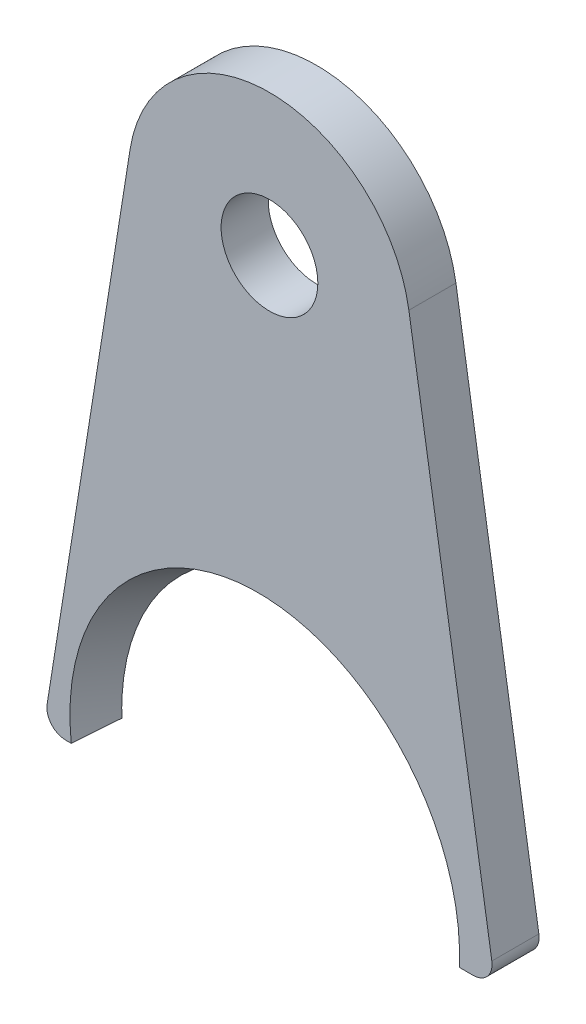
ISO-10303-21;
HEADER;
FILE_DESCRIPTION(('STEP AP214'),'2;1');
FILE_NAME('part.step','',(''),(''),'','','');
FILE_SCHEMA(('AUTOMOTIVE_DESIGN { 1 0 10303 214 1 1 1 1 }'));
ENDSEC;
DATA;
#1=APPLICATION_CONTEXT('core data for automotive mechanical design processes');
#2=APPLICATION_PROTOCOL_DEFINITION('international standard','automotive_design',2000,#1);
#3=PRODUCT_CONTEXT('',#1,'mechanical');
#4=PRODUCT('Part','Part','',(#3));
#5=PRODUCT_RELATED_PRODUCT_CATEGORY('part','',(#4));
#6=PRODUCT_DEFINITION_FORMATION('','',#4);
#7=PRODUCT_DEFINITION_CONTEXT('part definition',#1,'design');
#8=PRODUCT_DEFINITION('design','',#6,#7);
#9=PRODUCT_DEFINITION_SHAPE('','',#8);
#10=(LENGTH_UNIT() NAMED_UNIT(*) SI_UNIT(.MILLI.,.METRE.));
#11=(NAMED_UNIT(*) PLANE_ANGLE_UNIT() SI_UNIT($,.RADIAN.));
#12=(NAMED_UNIT(*) SI_UNIT($,.STERADIAN.) SOLID_ANGLE_UNIT());
#13=UNCERTAINTY_MEASURE_WITH_UNIT(LENGTH_MEASURE(1.E-05),#10,'distance_accuracy_value','');
#14=(GEOMETRIC_REPRESENTATION_CONTEXT(3) GLOBAL_UNCERTAINTY_ASSIGNED_CONTEXT((#13)) GLOBAL_UNIT_ASSIGNED_CONTEXT((#10,
#11,#12)) REPRESENTATION_CONTEXT('',''));
#15=CARTESIAN_POINT('',(0.,0.,0.));
#16=DIRECTION('',(0.,0.,1.));
#17=DIRECTION('',(1.,0.,0.));
#18=AXIS2_PLACEMENT_3D('',#15,#16,#17);
#19=CARTESIAN_POINT('',(0.,-35.211766,3.175));
#20=DIRECTION('',(0.,1.,0.));
#21=DIRECTION('',(-1.,0.,0.));
#22=AXIS2_PLACEMENT_3D('',#19,#20,#21);
#23=PLANE('',#22);
#24=DIRECTION('',(1.,0.,0.));
#25=VECTOR('',#24,1.);
#26=CARTESIAN_POINT('',(0.,-35.211766,0.));
#27=LINE('',#26,#25);
#28=CARTESIAN_POINT('',(13.1394340026446,-35.211766,0.));
#29=VERTEX_POINT('',#28);
#30=CARTESIAN_POINT('',(13.7522496650488,-35.211766,0.));
#31=VERTEX_POINT('',#30);
#32=EDGE_CURVE('E214',#29,#31,#27,.T.);
#33=ORIENTED_EDGE('',*,*,#32,.T.);
#34=DIRECTION('',(0.,0.,-1.));
#35=VECTOR('',#34,1.);
#36=CARTESIAN_POINT('',(13.7522496650488,-35.211766,3.175));
#37=LINE('',#36,#35);
#38=CARTESIAN_POINT('',(13.7522496650488,-35.211766,3.175));
#39=VERTEX_POINT('',#38);
#40=EDGE_CURVE('E12',#31,#39,#37,.F.);
#41=ORIENTED_EDGE('',*,*,#40,.T.);
#42=DIRECTION('',(1.,0.,0.));
#43=VECTOR('',#42,1.);
#44=CARTESIAN_POINT('',(0.,-35.211766,3.175));
#45=LINE('',#44,#43);
#46=CARTESIAN_POINT('',(12.8114151936818,-35.211766,3.175));
#47=VERTEX_POINT('',#46);
#48=EDGE_CURVE('E253',#47,#39,#45,.T.);
#49=ORIENTED_EDGE('',*,*,#48,.F.);
#50=CARTESIAN_POINT('',(0.00476535947638301,-35.211766,-0.0475119253614542));
#51=DIRECTION('',(0.,1.,0.));
#52=DIRECTION('',(0.0997974651310145,0.,-0.995007771805539));
#53=AXIS2_PLACEMENT_3D('',#50,#51,#52);
#54=ELLIPSE('',#53,38.1911531206193,13.081);
#55=EDGE_CURVE('E224',#29,#47,#54,.F.);
#56=ORIENTED_EDGE('',*,*,#55,.F.);
#57=EDGE_LOOP('',(#33,#41,#49,#56));
#58=FACE_BOUND('',#57,.T.);
#59=ADVANCED_FACE('F136',(#58),#23,.F.);
#60=CARTESIAN_POINT('',(-9.40696698253595,1.49485691271059,3.175));
#61=DIRECTION('',(-0.987608082156004,0.156940358289825,0.));
#62=DIRECTION('',(-0.156940358289825,-0.987608082156004,0.));
#63=AXIS2_PLACEMENT_3D('',#60,#61,#62);
#64=PLANE('',#63);
#65=DIRECTION('',(0.156940358289825,0.987608082156004,0.));
#66=VECTOR('',#65,1.);
#67=CARTESIAN_POINT('',(-9.40696698253595,1.49485691271059,0.));
#68=LINE('',#67,#66);
#69=CARTESIAN_POINT('',(-15.006511929387,-33.7424517449719,0.));
#70=VERTEX_POINT('',#69);
#71=CARTESIAN_POINT('',(-9.40696698253595,1.49485691271059,0.));
#72=VERTEX_POINT('',#71);
#73=EDGE_CURVE('E240',#70,#72,#68,.T.);
#74=ORIENTED_EDGE('',*,*,#73,.F.);
#75=DIRECTION('',(0.,0.,-1.));
#76=VECTOR('',#75,1.);
#77=CARTESIAN_POINT('',(-15.006511929387,-33.7424517449719,3.175));
#78=LINE('',#77,#76);
#79=CARTESIAN_POINT('',(-15.006511929387,-33.7424517449719,3.175));
#80=VERTEX_POINT('',#79);
#81=EDGE_CURVE('E262',#70,#80,#78,.F.);
#82=ORIENTED_EDGE('',*,*,#81,.T.);
#83=DIRECTION('',(0.156940358289825,0.987608082156004,0.));
#84=VECTOR('',#83,1.);
#85=CARTESIAN_POINT('',(-9.40696698253595,1.49485691271059,3.175));
#86=LINE('',#85,#84);
#87=CARTESIAN_POINT('',(-9.40696698253595,1.49485691271059,3.175));
#88=VERTEX_POINT('',#87);
#89=EDGE_CURVE('E237',#80,#88,#86,.T.);
#90=ORIENTED_EDGE('',*,*,#89,.T.);
#91=DIRECTION('',(0.,0.,-1.));
#92=VECTOR('',#91,1.);
#93=CARTESIAN_POINT('',(-9.40696698253595,1.49485691271059,3.175));
#94=LINE('',#93,#92);
#95=EDGE_CURVE('E212',#88,#72,#94,.T.);
#96=ORIENTED_EDGE('',*,*,#95,.T.);
#97=EDGE_LOOP('',(#74,#82,#90,#96));
#98=FACE_BOUND('',#97,.T.);
#99=ADVANCED_FACE('F287',(#98),#64,.T.);
#100=CARTESIAN_POINT('',(-13.7522496650488,-35.211766,3.175));
#101=VERTEX_POINT('',#100);
#102=CARTESIAN_POINT('',(-13.3718002828236,-35.211766,3.175));
#103=VERTEX_POINT('',#102);
#104=EDGE_CURVE('E248',#101,#103,#45,.T.);
#105=ORIENTED_EDGE('',*,*,#104,.F.);
#106=DIRECTION('',(0.,0.,-1.));
#107=VECTOR('',#106,1.);
#108=CARTESIAN_POINT('',(-13.7522496650488,-35.211766,0.));
#109=LINE('',#108,#107);
#110=CARTESIAN_POINT('',(-13.7522496650488,-35.211766,0.));
#111=VERTEX_POINT('',#110);
#112=EDGE_CURVE('E208',#101,#111,#109,.T.);
#113=ORIENTED_EDGE('',*,*,#112,.T.);
#114=CARTESIAN_POINT('',(-13.1383059825689,-35.211766,0.));
#115=VERTEX_POINT('',#114);
#116=EDGE_CURVE('E202',#111,#115,#27,.T.);
#117=ORIENTED_EDGE('',*,*,#116,.T.);
#118=EDGE_CURVE('E206',#103,#115,#54,.F.);
#119=ORIENTED_EDGE('',*,*,#118,.F.);
#120=EDGE_LOOP('',(#105,#113,#117,#119));
#121=FACE_BOUND('',#120,.T.);
#122=ADVANCED_FACE('F205',(#121),#23,.F.);
#123=CARTESIAN_POINT('',(9.40696698253595,1.49485691271059,3.175));
#124=DIRECTION('',(-0.987608082156004,-0.156940358289826,0.));
#125=DIRECTION('',(0.156940358289826,-0.987608082156004,0.));
#126=AXIS2_PLACEMENT_3D('',#123,#124,#125);
#127=PLANE('',#126);
#128=DIRECTION('',(-0.156940358289826,0.987608082156004,0.));
#129=VECTOR('',#128,1.);
#130=CARTESIAN_POINT('',(9.40696698253595,1.49485691271059,3.175));
#131=LINE('',#130,#129);
#132=CARTESIAN_POINT('',(15.006511929387,-33.7424517449719,3.175));
#133=VERTEX_POINT('',#132);
#134=CARTESIAN_POINT('',(9.40696698253595,1.49485691271059,3.175));
#135=VERTEX_POINT('',#134);
#136=EDGE_CURVE('E251',#133,#135,#131,.T.);
#137=ORIENTED_EDGE('',*,*,#136,.F.);
#138=DIRECTION('',(0.,0.,-1.));
#139=VECTOR('',#138,1.);
#140=CARTESIAN_POINT('',(15.006511929387,-33.7424517449719,3.175));
#141=LINE('',#140,#139);
#142=CARTESIAN_POINT('',(15.006511929387,-33.7424517449719,0.));
#143=VERTEX_POINT('',#142);
#144=EDGE_CURVE('E144',#133,#143,#141,.T.);
#145=ORIENTED_EDGE('',*,*,#144,.T.);
#146=DIRECTION('',(-0.156940358289826,0.987608082156004,0.));
#147=VECTOR('',#146,1.);
#148=CARTESIAN_POINT('',(9.40696698253595,1.49485691271059,0.));
#149=LINE('',#148,#147);
#150=CARTESIAN_POINT('',(9.40696698253595,1.49485691271059,0.));
#151=VERTEX_POINT('',#150);
#152=EDGE_CURVE('E211',#143,#151,#149,.T.);
#153=ORIENTED_EDGE('',*,*,#152,.T.);
#154=DIRECTION('',(0.,0.,-1.));
#155=VECTOR('',#154,1.);
#156=CARTESIAN_POINT('',(9.40696698253595,1.49485691271059,3.175));
#157=LINE('',#156,#155);
#158=EDGE_CURVE('E230',#135,#151,#157,.T.);
#159=ORIENTED_EDGE('',*,*,#158,.F.);
#160=EDGE_LOOP('',(#137,#145,#153,#159));
#161=FACE_BOUND('',#160,.T.);
#162=ADVANCED_FACE('F270',(#161),#127,.F.);
#163=CARTESIAN_POINT('',(0.,0.,3.175));
#164=DIRECTION('',(0.,0.,-1.));
#165=DIRECTION('',(-1.,0.,0.));
#166=AXIS2_PLACEMENT_3D('',#163,#164,#165);
#167=CYLINDRICAL_SURFACE('',#166,9.525);
#168=CARTESIAN_POINT('',(0.,0.,0.));
#169=DIRECTION('',(0.,0.,1.));
#170=DIRECTION('',(1.,0.,0.));
#171=AXIS2_PLACEMENT_3D('',#168,#169,#170);
#172=CIRCLE('',#171,9.525);
#173=EDGE_CURVE('E234',#151,#72,#172,.T.);
#174=ORIENTED_EDGE('',*,*,#173,.T.);
#175=ORIENTED_EDGE('',*,*,#95,.F.);
#176=CARTESIAN_POINT('',(0.,0.,3.175));
#177=DIRECTION('',(0.,0.,1.));
#178=DIRECTION('',(1.,0.,0.));
#179=AXIS2_PLACEMENT_3D('',#176,#177,#178);
#180=CIRCLE('',#179,9.525);
#181=EDGE_CURVE('E245',#135,#88,#180,.T.);
#182=ORIENTED_EDGE('',*,*,#181,.F.);
#183=ORIENTED_EDGE('',*,*,#158,.T.);
#184=EDGE_LOOP('',(#174,#175,#182,#183));
#185=FACE_BOUND('',#184,.T.);
#186=ADVANCED_FACE('F277',(#185),#167,.T.);
#187=CARTESIAN_POINT('',(0.,0.,3.175));
#188=DIRECTION('',(0.,0.,-1.));
#189=DIRECTION('',(-1.,0.,0.));
#190=AXIS2_PLACEMENT_3D('',#187,#188,#189);
#191=CYLINDRICAL_SURFACE('',#190,3.2639);
#192=CARTESIAN_POINT('',(0.,0.,3.175));
#193=DIRECTION('',(0.,0.,1.));
#194=DIRECTION('',(1.,0.,0.));
#195=AXIS2_PLACEMENT_3D('',#192,#193,#194);
#196=CIRCLE('',#195,3.2639);
#197=CARTESIAN_POINT('',(3.2639,0.,3.175));
#198=VERTEX_POINT('',#197);
#199=EDGE_CURVE('E233',#198,#198,#196,.T.);
#200=ORIENTED_EDGE('',*,*,#199,.T.);
#201=EDGE_LOOP('',(#200));
#202=FACE_BOUND('',#201,.T.);
#203=CARTESIAN_POINT('',(0.,0.,0.));
#204=DIRECTION('',(0.,0.,1.));
#205=DIRECTION('',(1.,0.,0.));
#206=AXIS2_PLACEMENT_3D('',#203,#204,#205);
#207=CIRCLE('',#206,3.2639);
#208=CARTESIAN_POINT('',(3.2639,0.,0.));
#209=VERTEX_POINT('',#208);
#210=EDGE_CURVE('E222',#209,#209,#207,.T.);
#211=ORIENTED_EDGE('',*,*,#210,.F.);
#212=EDGE_LOOP('',(#211));
#213=FACE_BOUND('',#212,.T.);
#214=ADVANCED_FACE('F300',(#202,#213),#191,.F.);
#215=CARTESIAN_POINT('',(0.,0.,3.175));
#216=DIRECTION('',(0.,0.,1.));
#217=DIRECTION('',(1.,0.,0.));
#218=AXIS2_PLACEMENT_3D('',#215,#216,#217);
#219=PLANE('',#218);
#220=ORIENTED_EDGE('',*,*,#89,.F.);
#221=CARTESIAN_POINT('',(-13.7522496650488,-33.941766,3.175));
#222=DIRECTION('',(0.,0.,1.));
#223=DIRECTION('',(1.,0.,0.));
#224=AXIS2_PLACEMENT_3D('',#221,#222,#223);
#225=CIRCLE('',#224,1.27);
#226=EDGE_CURVE('E265',#80,#101,#225,.T.);
#227=ORIENTED_EDGE('',*,*,#226,.T.);
#228=ORIENTED_EDGE('',*,*,#104,.T.);
#229=CARTESIAN_POINT('',(-0.318446710437376,-34.0310551677843,3.17500000000004));
#230=DIRECTION('',(0.,0.,1.));
#231=DIRECTION('',(0.264029713717794,-0.964514546429498,0.));
#232=AXIS2_PLACEMENT_3D('',#229,#230,#231);
#233=ELLIPSE('',#232,13.9930306632658,13.081);
#234=EDGE_CURVE('E221',#103,#47,#233,.F.);
#235=ORIENTED_EDGE('',*,*,#234,.T.);
#236=ORIENTED_EDGE('',*,*,#48,.T.);
#237=CARTESIAN_POINT('',(13.7522496650488,-33.941766,3.175));
#238=DIRECTION('',(0.,0.,1.));
#239=DIRECTION('',(1.,0.,0.));
#240=AXIS2_PLACEMENT_3D('',#237,#238,#239);
#241=CIRCLE('',#240,1.27);
#242=EDGE_CURVE('E151',#39,#133,#241,.T.);
#243=ORIENTED_EDGE('',*,*,#242,.T.);
#244=ORIENTED_EDGE('',*,*,#136,.T.);
#245=ORIENTED_EDGE('',*,*,#181,.T.);
#246=EDGE_LOOP('',(#220,#227,#228,#235,#236,#243,#244,#245));
#247=FACE_BOUND('',#246,.T.);
#248=ORIENTED_EDGE('',*,*,#199,.F.);
#249=EDGE_LOOP('',(#248));
#250=FACE_BOUND('',#249,.T.);
#251=ADVANCED_FACE('F280',(#247,#250),#219,.T.);
#252=CARTESIAN_POINT('',(0.,0.,0.));
#253=DIRECTION('',(0.,0.,1.));
#254=DIRECTION('',(1.,0.,0.));
#255=AXIS2_PLACEMENT_3D('',#252,#253,#254);
#256=PLANE('',#255);
#257=ORIENTED_EDGE('',*,*,#116,.F.);
#258=CARTESIAN_POINT('',(-13.7522496650488,-33.941766,0.));
#259=DIRECTION('',(0.,0.,1.));
#260=DIRECTION('',(1.,0.,0.));
#261=AXIS2_PLACEMENT_3D('',#258,#259,#260);
#262=CIRCLE('',#261,1.27);
#263=EDGE_CURVE('E260',#111,#70,#262,.F.);
#264=ORIENTED_EDGE('',*,*,#263,.T.);
#265=ORIENTED_EDGE('',*,*,#73,.T.);
#266=ORIENTED_EDGE('',*,*,#173,.F.);
#267=ORIENTED_EDGE('',*,*,#152,.F.);
#268=CARTESIAN_POINT('',(13.7522496650488,-33.941766,0.));
#269=DIRECTION('',(0.,0.,1.));
#270=DIRECTION('',(1.,0.,0.));
#271=AXIS2_PLACEMENT_3D('',#268,#269,#270);
#272=CIRCLE('',#271,1.27);
#273=EDGE_CURVE('E258',#143,#31,#272,.F.);
#274=ORIENTED_EDGE('',*,*,#273,.T.);
#275=ORIENTED_EDGE('',*,*,#32,.F.);
#276=CARTESIAN_POINT('',(-1.11022302462516E-13,-35.1943578891123,0.));
#277=DIRECTION('',(0.,0.,1.));
#278=DIRECTION('',(0.264029713717794,-0.964514546429498,0.));
#279=AXIS2_PLACEMENT_3D('',#276,#277,#278);
#280=ELLIPSE('',#279,13.9930306632658,13.081);
#281=EDGE_CURVE('E218',#115,#29,#280,.F.);
#282=ORIENTED_EDGE('',*,*,#281,.F.);
#283=EDGE_LOOP('',(#257,#264,#265,#266,#267,#274,#275,#282));
#284=FACE_BOUND('',#283,.T.);
#285=ORIENTED_EDGE('',*,*,#210,.T.);
#286=EDGE_LOOP('',(#285));
#287=FACE_BOUND('',#286,.T.);
#288=ADVANCED_FACE('F226',(#284,#287),#256,.F.);
#289=CARTESIAN_POINT('',(-68.993899624417,216.844016374224,687.887876143375));
#290=DIRECTION('',(0.0937609927809066,-0.342513879030733,-0.934822506631103));
#291=DIRECTION('',(0.902184120214388,-0.367856186909635,0.225267927111905));
#292=AXIS2_PLACEMENT_3D('',#289,#290,#291);
#293=CYLINDRICAL_SURFACE('',#292,13.081);
#294=ORIENTED_EDGE('',*,*,#118,.T.);
#295=ORIENTED_EDGE('',*,*,#281,.T.);
#296=ORIENTED_EDGE('',*,*,#55,.T.);
#297=ORIENTED_EDGE('',*,*,#234,.F.);
#298=EDGE_LOOP('',(#294,#295,#296,#297));
#299=FACE_BOUND('',#298,.T.);
#300=ADVANCED_FACE('F217',(#299),#293,.F.);
#301=CARTESIAN_POINT('',(-13.7522496650488,-33.941766,3.175));
#302=DIRECTION('',(0.,0.,1.));
#303=DIRECTION('',(1.,0.,0.));
#304=AXIS2_PLACEMENT_3D('',#301,#302,#303);
#305=CYLINDRICAL_SURFACE('',#304,1.27);
#306=ORIENTED_EDGE('',*,*,#226,.F.);
#307=ORIENTED_EDGE('',*,*,#81,.F.);
#308=ORIENTED_EDGE('',*,*,#263,.F.);
#309=ORIENTED_EDGE('',*,*,#112,.F.);
#310=EDGE_LOOP('',(#306,#307,#308,#309));
#311=FACE_BOUND('',#310,.T.);
#312=ADVANCED_FACE('F286',(#311),#305,.T.);
#313=CARTESIAN_POINT('',(13.7522496650488,-33.941766,3.175));
#314=DIRECTION('',(0.,0.,-1.));
#315=DIRECTION('',(-1.,0.,0.));
#316=AXIS2_PLACEMENT_3D('',#313,#314,#315);
#317=CYLINDRICAL_SURFACE('',#316,1.27);
#318=ORIENTED_EDGE('',*,*,#242,.F.);
#319=ORIENTED_EDGE('',*,*,#40,.F.);
#320=ORIENTED_EDGE('',*,*,#273,.F.);
#321=ORIENTED_EDGE('',*,*,#144,.F.);
#322=EDGE_LOOP('',(#318,#319,#320,#321));
#323=FACE_BOUND('',#322,.T.);
#324=ADVANCED_FACE('F138',(#323),#317,.T.);
#325=CLOSED_SHELL('',(#59,#99,#122,#162,#186,#214,#251,#288,#300,#312,#324));
#326=MANIFOLD_SOLID_BREP('B2',#325);
#327=ADVANCED_BREP_SHAPE_REPRESENTATION('',(#18,#326),#14);
#328=SHAPE_DEFINITION_REPRESENTATION(#9,#327);
ENDSEC;
END-ISO-10303-21;
